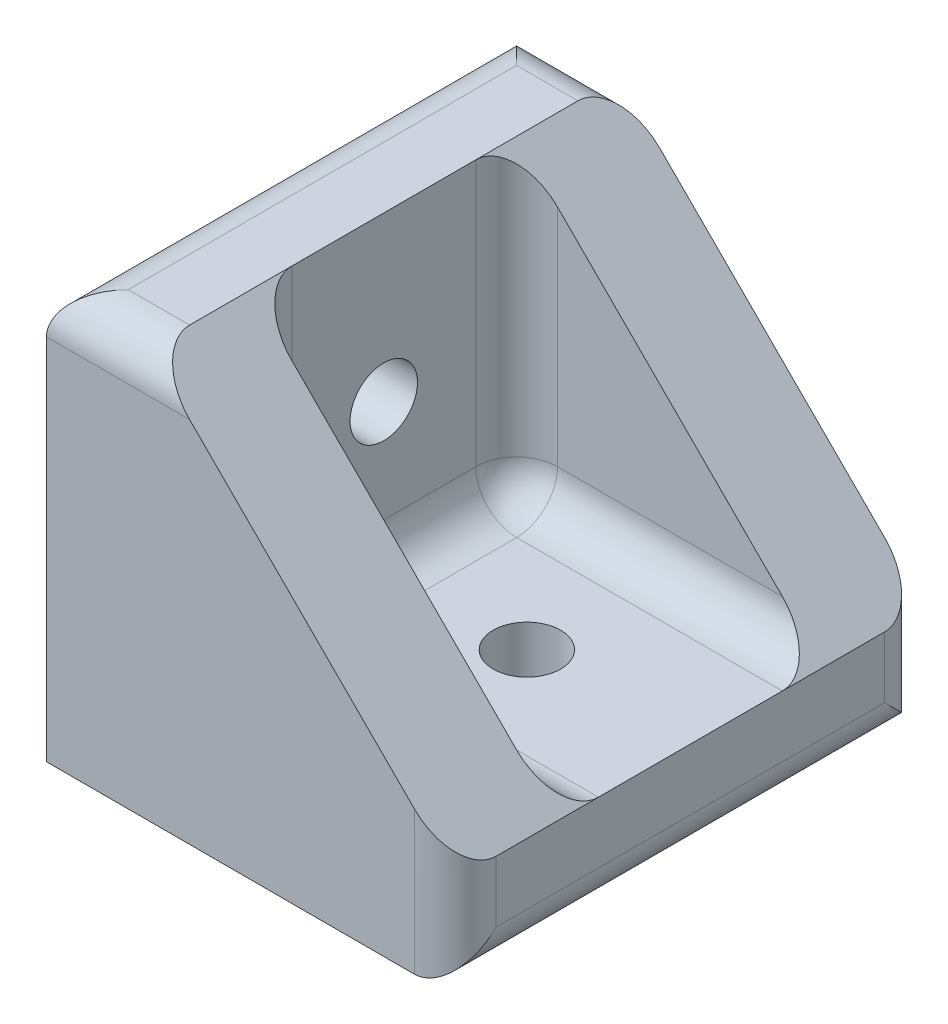
ISO-10303-21;
HEADER;
FILE_DESCRIPTION(('STEP AP214'),'2;1');
FILE_NAME('part.step','',(''),(''),'','','');
FILE_SCHEMA(('AUTOMOTIVE_DESIGN { 1 0 10303 214 1 1 1 1 }'));
ENDSEC;
DATA;
#1=APPLICATION_CONTEXT('core data for automotive mechanical design processes');
#2=APPLICATION_PROTOCOL_DEFINITION('international standard','automotive_design',2000,#1);
#3=PRODUCT_CONTEXT('',#1,'mechanical');
#4=PRODUCT('Part','Part','',(#3));
#5=PRODUCT_RELATED_PRODUCT_CATEGORY('part','',(#4));
#6=PRODUCT_DEFINITION_FORMATION('','',#4);
#7=PRODUCT_DEFINITION_CONTEXT('part definition',#1,'design');
#8=PRODUCT_DEFINITION('design','',#6,#7);
#9=PRODUCT_DEFINITION_SHAPE('','',#8);
#10=(LENGTH_UNIT() NAMED_UNIT(*) SI_UNIT(.MILLI.,.METRE.));
#11=(NAMED_UNIT(*) PLANE_ANGLE_UNIT() SI_UNIT($,.RADIAN.));
#12=(NAMED_UNIT(*) SI_UNIT($,.STERADIAN.) SOLID_ANGLE_UNIT());
#13=UNCERTAINTY_MEASURE_WITH_UNIT(LENGTH_MEASURE(1.E-05),#10,'distance_accuracy_value','');
#14=(GEOMETRIC_REPRESENTATION_CONTEXT(3) GLOBAL_UNCERTAINTY_ASSIGNED_CONTEXT((#13)) GLOBAL_UNIT_ASSIGNED_CONTEXT((#10,
#11,#12)) REPRESENTATION_CONTEXT('',''));
#15=CARTESIAN_POINT('',(0.,0.,0.));
#16=DIRECTION('',(0.,0.,1.));
#17=DIRECTION('',(1.,0.,0.));
#18=AXIS2_PLACEMENT_3D('',#15,#16,#17);
#19=CARTESIAN_POINT('',(5.,20.,-23.));
#20=DIRECTION('',(0.707106781186548,0.707106781186548,0.));
#21=DIRECTION('',(-0.707106781186548,0.707106781186548,0.));
#22=AXIS2_PLACEMENT_3D('',#19,#20,#21);
#23=PLANE('',#22);
#24=DIRECTION('',(-0.707106781186547,0.707106781186547,0.));
#25=VECTOR('',#24,1.);
#26=CARTESIAN_POINT('',(5.,20.,0.));
#27=LINE('',#26,#25);
#28=CARTESIAN_POINT('',(18.,7.,0.));
#29=VERTEX_POINT('',#28);
#30=CARTESIAN_POINT('',(7.,18.,0.));
#31=VERTEX_POINT('',#30);
#32=EDGE_CURVE('E184',#29,#31,#27,.T.);
#33=ORIENTED_EDGE('',*,*,#32,.F.);
#34=CARTESIAN_POINT('',(18.,7.,-2.));
#35=DIRECTION('',(0.707106781186548,0.707106781186548,0.));
#36=DIRECTION('',(0.707106781186548,-0.707106781186548,0.));
#37=AXIS2_PLACEMENT_3D('',#34,#35,#36);
#38=ELLIPSE('',#37,2.82842712474619,2.);
#39=CARTESIAN_POINT('',(20.,5.,-2.));
#40=VERTEX_POINT('',#39);
#41=EDGE_CURVE('E271',#29,#40,#38,.T.);
#42=ORIENTED_EDGE('',*,*,#41,.T.);
#43=DIRECTION('',(0.,0.,1.));
#44=VECTOR('',#43,1.);
#45=CARTESIAN_POINT('',(20.,5.,-23.));
#46=LINE('',#45,#44);
#47=CARTESIAN_POINT('',(20.,5.,-7.));
#48=VERTEX_POINT('',#47);
#49=EDGE_CURVE('E165',#48,#40,#46,.T.);
#50=ORIENTED_EDGE('',*,*,#49,.F.);
#51=CARTESIAN_POINT('',(18.,7.,-7.));
#52=DIRECTION('',(0.707106781186548,0.707106781186548,0.));
#53=DIRECTION('',(0.707106781186548,-0.707106781186548,0.));
#54=AXIS2_PLACEMENT_3D('',#51,#52,#53);
#55=ELLIPSE('',#54,2.82842712474619,2.);
#56=CARTESIAN_POINT('',(18.,7.,-5.));
#57=VERTEX_POINT('',#56);
#58=EDGE_CURVE('E226',#48,#57,#55,.F.);
#59=ORIENTED_EDGE('',*,*,#58,.T.);
#60=DIRECTION('',(-0.707106781186548,0.707106781186548,0.));
#61=VECTOR('',#60,1.);
#62=CARTESIAN_POINT('',(5.,20.,-5.));
#63=LINE('',#62,#61);
#64=CARTESIAN_POINT('',(7.,18.,-5.));
#65=VERTEX_POINT('',#64);
#66=EDGE_CURVE('E189',#57,#65,#63,.T.);
#67=ORIENTED_EDGE('',*,*,#66,.T.);
#68=CARTESIAN_POINT('',(7.,18.,-7.));
#69=DIRECTION('',(0.707106781186548,0.707106781186548,0.));
#70=DIRECTION('',(0.707106781186548,-0.707106781186548,0.));
#71=AXIS2_PLACEMENT_3D('',#68,#69,#70);
#72=ELLIPSE('',#71,2.82842712474619,2.);
#73=CARTESIAN_POINT('',(5.,20.,-7.));
#74=VERTEX_POINT('',#73);
#75=EDGE_CURVE('E224',#65,#74,#72,.F.);
#76=ORIENTED_EDGE('',*,*,#75,.T.);
#77=DIRECTION('',(0.,0.,1.));
#78=VECTOR('',#77,1.);
#79=CARTESIAN_POINT('',(5.,20.,-23.));
#80=LINE('',#79,#78);
#81=CARTESIAN_POINT('',(5.,20.,-2.));
#82=VERTEX_POINT('',#81);
#83=EDGE_CURVE('E192',#74,#82,#80,.T.);
#84=ORIENTED_EDGE('',*,*,#83,.T.);
#85=CARTESIAN_POINT('',(7.,18.,-2.));
#86=DIRECTION('',(0.707106781186548,0.707106781186548,0.));
#87=DIRECTION('',(0.707106781186548,-0.707106781186548,0.));
#88=AXIS2_PLACEMENT_3D('',#85,#86,#87);
#89=ELLIPSE('',#88,2.82842712474619,2.);
#90=EDGE_CURVE('E63',#82,#31,#89,.T.);
#91=ORIENTED_EDGE('',*,*,#90,.T.);
#92=EDGE_LOOP('',(#33,#42,#50,#59,#67,#76,#84,#91));
#93=FACE_BOUND('',#92,.T.);
#94=ADVANCED_FACE('F39',(#93),#23,.T.);
#95=CARTESIAN_POINT('',(20.,0.,-23.));
#96=DIRECTION('',(0.,-1.,0.));
#97=DIRECTION('',(0.,0.,-1.));
#98=AXIS2_PLACEMENT_3D('',#95,#96,#97);
#99=PLANE('',#98);
#100=CARTESIAN_POINT('',(12.,0.,-11.5));
#101=DIRECTION('',(0.,1.,0.));
#102=DIRECTION('',(0.,0.,1.));
#103=AXIS2_PLACEMENT_3D('',#100,#101,#102);
#104=CIRCLE('',#103,1.65);
#105=CARTESIAN_POINT('',(12.,0.,-9.85));
#106=VERTEX_POINT('',#105);
#107=EDGE_CURVE('E281',#106,#106,#104,.T.);
#108=ORIENTED_EDGE('',*,*,#107,.T.);
#109=EDGE_LOOP('',(#108));
#110=FACE_BOUND('',#109,.T.);
#111=DIRECTION('',(1.,0.,0.));
#112=VECTOR('',#111,1.);
#113=CARTESIAN_POINT('',(20.,0.,-23.));
#114=LINE('',#113,#112);
#115=CARTESIAN_POINT('',(0.,0.,-23.));
#116=VERTEX_POINT('',#115);
#117=CARTESIAN_POINT('',(18.,0.,-23.));
#118=VERTEX_POINT('',#117);
#119=EDGE_CURVE('E167',#116,#118,#114,.T.);
#120=ORIENTED_EDGE('',*,*,#119,.T.);
#121=DIRECTION('',(0.,0.,1.));
#122=VECTOR('',#121,1.);
#123=CARTESIAN_POINT('',(18.,0.,-23.));
#124=LINE('',#123,#122);
#125=CARTESIAN_POINT('',(18.,0.,0.));
#126=VERTEX_POINT('',#125);
#127=EDGE_CURVE('E48',#118,#126,#124,.T.);
#128=ORIENTED_EDGE('',*,*,#127,.T.);
#129=DIRECTION('',(1.,0.,0.));
#130=VECTOR('',#129,1.);
#131=CARTESIAN_POINT('',(20.,0.,0.));
#132=LINE('',#131,#130);
#133=CARTESIAN_POINT('',(0.,0.,0.));
#134=VERTEX_POINT('',#133);
#135=EDGE_CURVE('E173',#134,#126,#132,.T.);
#136=ORIENTED_EDGE('',*,*,#135,.F.);
#137=DIRECTION('',(0.,0.,1.));
#138=VECTOR('',#137,1.);
#139=CARTESIAN_POINT('',(0.,0.,-23.));
#140=LINE('',#139,#138);
#141=EDGE_CURVE('E156',#116,#134,#140,.T.);
#142=ORIENTED_EDGE('',*,*,#141,.F.);
#143=EDGE_LOOP('',(#120,#128,#136,#142));
#144=FACE_BOUND('',#143,.T.);
#145=ADVANCED_FACE('F169',(#110,#144),#99,.T.);
#146=CARTESIAN_POINT('',(0.,0.,-23.));
#147=DIRECTION('',(-1.,0.,0.));
#148=DIRECTION('',(0.,0.,1.));
#149=AXIS2_PLACEMENT_3D('',#146,#147,#148);
#150=PLANE('',#149);
#151=CARTESIAN_POINT('',(0.,12.,-11.5));
#152=DIRECTION('',(1.,0.,0.));
#153=DIRECTION('',(0.,0.,-1.));
#154=AXIS2_PLACEMENT_3D('',#151,#152,#153);
#155=CIRCLE('',#154,1.65);
#156=CARTESIAN_POINT('',(0.,12.,-13.15));
#157=VERTEX_POINT('',#156);
#158=EDGE_CURVE('E292',#157,#157,#155,.T.);
#159=ORIENTED_EDGE('',*,*,#158,.T.);
#160=EDGE_LOOP('',(#159));
#161=FACE_BOUND('',#160,.T.);
#162=DIRECTION('',(0.,-1.,0.));
#163=VECTOR('',#162,1.);
#164=CARTESIAN_POINT('',(0.,0.,0.));
#165=LINE('',#164,#163);
#166=CARTESIAN_POINT('',(0.,18.,0.));
#167=VERTEX_POINT('',#166);
#168=EDGE_CURVE('E181',#167,#134,#165,.T.);
#169=ORIENTED_EDGE('',*,*,#168,.F.);
#170=DIRECTION('',(0.,0.,1.));
#171=VECTOR('',#170,1.);
#172=CARTESIAN_POINT('',(0.,18.,-23.));
#173=LINE('',#172,#171);
#174=CARTESIAN_POINT('',(0.,18.,-23.));
#175=VERTEX_POINT('',#174);
#176=EDGE_CURVE('E11',#167,#175,#173,.F.);
#177=ORIENTED_EDGE('',*,*,#176,.T.);
#178=DIRECTION('',(0.,-1.,0.));
#179=VECTOR('',#178,1.);
#180=CARTESIAN_POINT('',(0.,0.,-23.));
#181=LINE('',#180,#179);
#182=EDGE_CURVE('E154',#175,#116,#181,.T.);
#183=ORIENTED_EDGE('',*,*,#182,.T.);
#184=ORIENTED_EDGE('',*,*,#141,.T.);
#185=EDGE_LOOP('',(#169,#177,#183,#184));
#186=FACE_BOUND('',#185,.T.);
#187=ADVANCED_FACE('F160',(#161,#186),#150,.T.);
#188=CARTESIAN_POINT('',(0.,20.,-23.));
#189=DIRECTION('',(0.,1.,0.));
#190=DIRECTION('',(0.,0.,1.));
#191=AXIS2_PLACEMENT_3D('',#188,#189,#190);
#192=PLANE('',#191);
#193=CARTESIAN_POINT('',(5.,20.,-21.));
#194=VERTEX_POINT('',#193);
#195=CARTESIAN_POINT('',(5.,20.,-16.));
#196=VERTEX_POINT('',#195);
#197=EDGE_CURVE('E174',#194,#196,#80,.T.);
#198=ORIENTED_EDGE('',*,*,#197,.F.);
#199=DIRECTION('',(-1.,0.,0.));
#200=VECTOR('',#199,1.);
#201=CARTESIAN_POINT('',(0.,20.,-21.));
#202=LINE('',#201,#200);
#203=CARTESIAN_POINT('',(2.,20.,-21.));
#204=VERTEX_POINT('',#203);
#205=EDGE_CURVE('E255',#194,#204,#202,.T.);
#206=ORIENTED_EDGE('',*,*,#205,.T.);
#207=DIRECTION('',(0.,0.,1.));
#208=VECTOR('',#207,1.);
#209=CARTESIAN_POINT('',(2.,20.,-23.));
#210=LINE('',#209,#208);
#211=CARTESIAN_POINT('',(2.,20.,-2.));
#212=VERTEX_POINT('',#211);
#213=EDGE_CURVE('E229',#204,#212,#210,.T.);
#214=ORIENTED_EDGE('',*,*,#213,.T.);
#215=DIRECTION('',(-1.,0.,0.));
#216=VECTOR('',#215,1.);
#217=CARTESIAN_POINT('',(5.,20.,-2.));
#218=LINE('',#217,#216);
#219=EDGE_CURVE('E249',#212,#82,#218,.F.);
#220=ORIENTED_EDGE('',*,*,#219,.T.);
#221=ORIENTED_EDGE('',*,*,#83,.F.);
#222=DIRECTION('',(0.,0.,1.));
#223=VECTOR('',#222,1.);
#224=CARTESIAN_POINT('',(5.,20.,-23.));
#225=LINE('',#224,#223);
#226=EDGE_CURVE('E191',#196,#74,#225,.T.);
#227=ORIENTED_EDGE('',*,*,#226,.F.);
#228=EDGE_LOOP('',(#198,#206,#214,#220,#221,#227));
#229=FACE_BOUND('',#228,.T.);
#230=ADVANCED_FACE('F330',(#229),#192,.T.);
#231=DIRECTION('',(-0.707106781186547,0.707106781186547,0.));
#232=VECTOR('',#231,1.);
#233=CARTESIAN_POINT('',(5.,20.,-23.));
#234=LINE('',#233,#232);
#235=CARTESIAN_POINT('',(18.,7.,-23.));
#236=VERTEX_POINT('',#235);
#237=CARTESIAN_POINT('',(7.,18.,-23.));
#238=VERTEX_POINT('',#237);
#239=EDGE_CURVE('E164',#236,#238,#234,.T.);
#240=ORIENTED_EDGE('',*,*,#239,.T.);
#241=CARTESIAN_POINT('',(7.,18.,-21.));
#242=DIRECTION('',(0.707106781186548,0.707106781186548,0.));
#243=DIRECTION('',(-0.707106781186548,0.707106781186548,0.));
#244=AXIS2_PLACEMENT_3D('',#241,#242,#243);
#245=ELLIPSE('',#244,2.82842712474619,2.);
#246=EDGE_CURVE('E257',#238,#194,#245,.T.);
#247=ORIENTED_EDGE('',*,*,#246,.T.);
#248=ORIENTED_EDGE('',*,*,#197,.T.);
#249=CARTESIAN_POINT('',(7.,18.,-16.));
#250=DIRECTION('',(0.707106781186548,0.707106781186548,0.));
#251=DIRECTION('',(-0.707106781186548,0.707106781186548,0.));
#252=AXIS2_PLACEMENT_3D('',#249,#250,#251);
#253=ELLIPSE('',#252,2.82842712474619,2.);
#254=CARTESIAN_POINT('',(7.,18.,-18.));
#255=VERTEX_POINT('',#254);
#256=EDGE_CURVE('E219',#196,#255,#253,.F.);
#257=ORIENTED_EDGE('',*,*,#256,.T.);
#258=DIRECTION('',(-0.707106781186548,0.707106781186548,0.));
#259=VECTOR('',#258,1.);
#260=CARTESIAN_POINT('',(5.,20.,-18.));
#261=LINE('',#260,#259);
#262=CARTESIAN_POINT('',(18.,7.,-18.));
#263=VERTEX_POINT('',#262);
#264=EDGE_CURVE('E297',#263,#255,#261,.T.);
#265=ORIENTED_EDGE('',*,*,#264,.F.);
#266=CARTESIAN_POINT('',(18.,7.,-16.));
#267=DIRECTION('',(0.707106781186548,0.707106781186548,0.));
#268=DIRECTION('',(-0.707106781186548,0.707106781186548,0.));
#269=AXIS2_PLACEMENT_3D('',#266,#267,#268);
#270=ELLIPSE('',#269,2.82842712474619,2.);
#271=CARTESIAN_POINT('',(20.,5.,-16.));
#272=VERTEX_POINT('',#271);
#273=EDGE_CURVE('E225',#263,#272,#270,.F.);
#274=ORIENTED_EDGE('',*,*,#273,.T.);
#275=CARTESIAN_POINT('',(20.,5.,-21.));
#276=VERTEX_POINT('',#275);
#277=EDGE_CURVE('E196',#276,#272,#46,.T.);
#278=ORIENTED_EDGE('',*,*,#277,.F.);
#279=CARTESIAN_POINT('',(18.,7.,-21.));
#280=DIRECTION('',(0.707106781186548,0.707106781186548,0.));
#281=DIRECTION('',(-0.707106781186548,0.707106781186548,0.));
#282=AXIS2_PLACEMENT_3D('',#279,#280,#281);
#283=ELLIPSE('',#282,2.82842712474619,2.);
#284=EDGE_CURVE('E260',#276,#236,#283,.T.);
#285=ORIENTED_EDGE('',*,*,#284,.T.);
#286=EDGE_LOOP('',(#240,#247,#248,#257,#265,#274,#278,#285));
#287=FACE_BOUND('',#286,.T.);
#288=ADVANCED_FACE('F331',(#287),#23,.T.);
#289=CARTESIAN_POINT('',(20.,5.,-23.));
#290=DIRECTION('',(1.,0.,0.));
#291=DIRECTION('',(0.,0.,-1.));
#292=AXIS2_PLACEMENT_3D('',#289,#290,#291);
#293=PLANE('',#292);
#294=DIRECTION('',(0.,0.,1.));
#295=VECTOR('',#294,1.);
#296=CARTESIAN_POINT('',(20.,2.,-23.));
#297=LINE('',#296,#295);
#298=CARTESIAN_POINT('',(20.,2.,-2.));
#299=VERTEX_POINT('',#298);
#300=CARTESIAN_POINT('',(20.,2.,-21.));
#301=VERTEX_POINT('',#300);
#302=EDGE_CURVE('E265',#299,#301,#297,.F.);
#303=ORIENTED_EDGE('',*,*,#302,.T.);
#304=DIRECTION('',(0.,1.,0.));
#305=VECTOR('',#304,1.);
#306=CARTESIAN_POINT('',(20.,5.,-21.));
#307=LINE('',#306,#305);
#308=EDGE_CURVE('E268',#301,#276,#307,.T.);
#309=ORIENTED_EDGE('',*,*,#308,.T.);
#310=ORIENTED_EDGE('',*,*,#277,.T.);
#311=DIRECTION('',(0.,0.,1.));
#312=VECTOR('',#311,1.);
#313=CARTESIAN_POINT('',(20.,5.,-23.));
#314=LINE('',#313,#312);
#315=EDGE_CURVE('E296',#272,#48,#314,.T.);
#316=ORIENTED_EDGE('',*,*,#315,.T.);
#317=ORIENTED_EDGE('',*,*,#49,.T.);
#318=DIRECTION('',(0.,1.,0.));
#319=VECTOR('',#318,1.);
#320=CARTESIAN_POINT('',(20.,0.,-2.));
#321=LINE('',#320,#319);
#322=EDGE_CURVE('E263',#40,#299,#321,.F.);
#323=ORIENTED_EDGE('',*,*,#322,.T.);
#324=EDGE_LOOP('',(#303,#309,#310,#316,#317,#323));
#325=FACE_BOUND('',#324,.T.);
#326=ADVANCED_FACE('F362',(#325),#293,.T.);
#327=CARTESIAN_POINT('',(0.,0.,-23.));
#328=DIRECTION('',(0.,0.,-1.));
#329=DIRECTION('',(-1.,0.,0.));
#330=AXIS2_PLACEMENT_3D('',#327,#328,#329);
#331=PLANE('',#330);
#332=ORIENTED_EDGE('',*,*,#182,.F.);
#333=DIRECTION('',(-1.,0.,0.));
#334=VECTOR('',#333,1.);
#335=CARTESIAN_POINT('',(0.,18.,-23.));
#336=LINE('',#335,#334);
#337=EDGE_CURVE('E259',#175,#238,#336,.F.);
#338=ORIENTED_EDGE('',*,*,#337,.T.);
#339=ORIENTED_EDGE('',*,*,#239,.F.);
#340=DIRECTION('',(0.,1.,0.));
#341=VECTOR('',#340,1.);
#342=CARTESIAN_POINT('',(18.,0.,-23.));
#343=LINE('',#342,#341);
#344=EDGE_CURVE('E179',#236,#118,#343,.F.);
#345=ORIENTED_EDGE('',*,*,#344,.T.);
#346=ORIENTED_EDGE('',*,*,#119,.F.);
#347=EDGE_LOOP('',(#332,#338,#339,#345,#346));
#348=FACE_BOUND('',#347,.T.);
#349=ADVANCED_FACE('F180',(#348),#331,.T.);
#350=CARTESIAN_POINT('',(0.,0.,0.));
#351=DIRECTION('',(0.,0.,-1.));
#352=DIRECTION('',(-1.,0.,0.));
#353=AXIS2_PLACEMENT_3D('',#350,#351,#352);
#354=PLANE('',#353);
#355=ORIENTED_EDGE('',*,*,#135,.T.);
#356=DIRECTION('',(0.,1.,0.));
#357=VECTOR('',#356,1.);
#358=CARTESIAN_POINT('',(18.,5.,0.));
#359=LINE('',#358,#357);
#360=EDGE_CURVE('E269',#126,#29,#359,.T.);
#361=ORIENTED_EDGE('',*,*,#360,.T.);
#362=ORIENTED_EDGE('',*,*,#32,.T.);
#363=DIRECTION('',(-1.,0.,0.));
#364=VECTOR('',#363,1.);
#365=CARTESIAN_POINT('',(0.,18.,0.));
#366=LINE('',#365,#364);
#367=EDGE_CURVE('E57',#31,#167,#366,.T.);
#368=ORIENTED_EDGE('',*,*,#367,.T.);
#369=ORIENTED_EDGE('',*,*,#168,.T.);
#370=EDGE_LOOP('',(#355,#361,#362,#368,#369));
#371=FACE_BOUND('',#370,.T.);
#372=ADVANCED_FACE('F376',(#371),#354,.F.);
#373=CARTESIAN_POINT('',(20.,5.,-23.));
#374=DIRECTION('',(0.,-1.,0.));
#375=DIRECTION('',(0.,0.,-1.));
#376=AXIS2_PLACEMENT_3D('',#373,#374,#375);
#377=PLANE('',#376);
#378=CARTESIAN_POINT('',(12.,5.,-11.5));
#379=DIRECTION('',(0.,1.,0.));
#380=DIRECTION('',(0.,0.,1.));
#381=AXIS2_PLACEMENT_3D('',#378,#379,#380);
#382=CIRCLE('',#381,1.65);
#383=CARTESIAN_POINT('',(12.,5.,-9.85));
#384=VERTEX_POINT('',#383);
#385=EDGE_CURVE('E290',#384,#384,#382,.T.);
#386=ORIENTED_EDGE('',*,*,#385,.F.);
#387=EDGE_LOOP('',(#386));
#388=FACE_BOUND('',#387,.T.);
#389=ORIENTED_EDGE('',*,*,#315,.F.);
#390=DIRECTION('',(1.,0.,0.));
#391=VECTOR('',#390,1.);
#392=CARTESIAN_POINT('',(5.,5.,-16.));
#393=LINE('',#392,#391);
#394=CARTESIAN_POINT('',(7.,5.,-16.));
#395=VERTEX_POINT('',#394);
#396=EDGE_CURVE('E213',#272,#395,#393,.F.);
#397=ORIENTED_EDGE('',*,*,#396,.T.);
#398=DIRECTION('',(0.,0.,1.));
#399=VECTOR('',#398,1.);
#400=CARTESIAN_POINT('',(7.,5.,-5.));
#401=LINE('',#400,#399);
#402=CARTESIAN_POINT('',(7.,5.,-7.));
#403=VERTEX_POINT('',#402);
#404=EDGE_CURVE('E209',#395,#403,#401,.T.);
#405=ORIENTED_EDGE('',*,*,#404,.T.);
#406=DIRECTION('',(1.,0.,0.));
#407=VECTOR('',#406,1.);
#408=CARTESIAN_POINT('',(20.,5.,-7.));
#409=LINE('',#408,#407);
#410=EDGE_CURVE('E214',#403,#48,#409,.T.);
#411=ORIENTED_EDGE('',*,*,#410,.T.);
#412=EDGE_LOOP('',(#389,#397,#405,#411));
#413=FACE_BOUND('',#412,.T.);
#414=ADVANCED_FACE('F378',(#388,#413),#377,.F.);
#415=CARTESIAN_POINT('',(5.,0.,-23.));
#416=DIRECTION('',(-1.,0.,0.));
#417=DIRECTION('',(0.,0.,1.));
#418=AXIS2_PLACEMENT_3D('',#415,#416,#417);
#419=PLANE('',#418);
#420=CARTESIAN_POINT('',(5.,12.,-11.5));
#421=DIRECTION('',(1.,0.,0.));
#422=DIRECTION('',(0.,0.,-1.));
#423=AXIS2_PLACEMENT_3D('',#420,#421,#422);
#424=CIRCLE('',#423,1.65);
#425=CARTESIAN_POINT('',(5.,12.,-13.15));
#426=VERTEX_POINT('',#425);
#427=EDGE_CURVE('E407',#426,#426,#424,.T.);
#428=ORIENTED_EDGE('',*,*,#427,.F.);
#429=EDGE_LOOP('',(#428));
#430=FACE_BOUND('',#429,.T.);
#431=DIRECTION('',(0.,0.,1.));
#432=VECTOR('',#431,1.);
#433=CARTESIAN_POINT('',(5.,7.,-18.));
#434=LINE('',#433,#432);
#435=CARTESIAN_POINT('',(5.,7.,-7.));
#436=VERTEX_POINT('',#435);
#437=CARTESIAN_POINT('',(5.,7.,-16.));
#438=VERTEX_POINT('',#437);
#439=EDGE_CURVE('E205',#436,#438,#434,.F.);
#440=ORIENTED_EDGE('',*,*,#439,.T.);
#441=DIRECTION('',(0.,-1.,0.));
#442=VECTOR('',#441,1.);
#443=CARTESIAN_POINT('',(5.,20.,-16.));
#444=LINE('',#443,#442);
#445=EDGE_CURVE('E207',#438,#196,#444,.F.);
#446=ORIENTED_EDGE('',*,*,#445,.T.);
#447=ORIENTED_EDGE('',*,*,#226,.T.);
#448=DIRECTION('',(0.,-1.,0.));
#449=VECTOR('',#448,1.);
#450=CARTESIAN_POINT('',(5.,0.,-7.));
#451=LINE('',#450,#449);
#452=EDGE_CURVE('E202',#74,#436,#451,.T.);
#453=ORIENTED_EDGE('',*,*,#452,.T.);
#454=EDGE_LOOP('',(#440,#446,#447,#453));
#455=FACE_BOUND('',#454,.T.);
#456=ADVANCED_FACE('F316',(#430,#455),#419,.F.);
#457=CARTESIAN_POINT('',(0.,0.,-18.));
#458=DIRECTION('',(0.,0.,-1.));
#459=DIRECTION('',(-1.,0.,0.));
#460=AXIS2_PLACEMENT_3D('',#457,#458,#459);
#461=PLANE('',#460);
#462=ORIENTED_EDGE('',*,*,#264,.T.);
#463=DIRECTION('',(0.,-1.,0.));
#464=VECTOR('',#463,1.);
#465=CARTESIAN_POINT('',(7.,5.,-18.));
#466=LINE('',#465,#464);
#467=CARTESIAN_POINT('',(7.,7.,-18.));
#468=VERTEX_POINT('',#467);
#469=EDGE_CURVE('E198',#255,#468,#466,.T.);
#470=ORIENTED_EDGE('',*,*,#469,.T.);
#471=DIRECTION('',(1.,0.,0.));
#472=VECTOR('',#471,1.);
#473=CARTESIAN_POINT('',(20.,7.,-18.));
#474=LINE('',#473,#472);
#475=EDGE_CURVE('E172',#468,#263,#474,.T.);
#476=ORIENTED_EDGE('',*,*,#475,.T.);
#477=EDGE_LOOP('',(#462,#470,#476));
#478=FACE_BOUND('',#477,.T.);
#479=ADVANCED_FACE('F389',(#478),#461,.F.);
#480=CARTESIAN_POINT('',(0.,0.,-5.));
#481=DIRECTION('',(0.,0.,-1.));
#482=DIRECTION('',(-1.,0.,0.));
#483=AXIS2_PLACEMENT_3D('',#480,#481,#482);
#484=PLANE('',#483);
#485=DIRECTION('',(1.,0.,0.));
#486=VECTOR('',#485,1.);
#487=CARTESIAN_POINT('',(0.,7.,-5.));
#488=LINE('',#487,#486);
#489=CARTESIAN_POINT('',(7.,7.,-5.));
#490=VERTEX_POINT('',#489);
#491=EDGE_CURVE('E216',#57,#490,#488,.F.);
#492=ORIENTED_EDGE('',*,*,#491,.T.);
#493=DIRECTION('',(0.,-1.,0.));
#494=VECTOR('',#493,1.);
#495=CARTESIAN_POINT('',(7.,0.,-5.));
#496=LINE('',#495,#494);
#497=EDGE_CURVE('E217',#490,#65,#496,.F.);
#498=ORIENTED_EDGE('',*,*,#497,.T.);
#499=ORIENTED_EDGE('',*,*,#66,.F.);
#500=EDGE_LOOP('',(#492,#498,#499));
#501=FACE_BOUND('',#500,.T.);
#502=ADVANCED_FACE('F385',(#501),#484,.T.);
#503=CARTESIAN_POINT('',(20.,7.,-7.));
#504=DIRECTION('',(1.,0.,0.));
#505=DIRECTION('',(0.,0.,-1.));
#506=AXIS2_PLACEMENT_3D('',#503,#504,#505);
#507=CYLINDRICAL_SURFACE('',#506,2.);
#508=ORIENTED_EDGE('',*,*,#58,.F.);
#509=ORIENTED_EDGE('',*,*,#410,.F.);
#510=CARTESIAN_POINT('',(7.,7.,-7.));
#511=DIRECTION('',(1.,0.,0.));
#512=DIRECTION('',(0.,1.,0.));
#513=AXIS2_PLACEMENT_3D('',#510,#511,#512);
#514=CIRCLE('',#513,2.);
#515=EDGE_CURVE('E246',#490,#403,#514,.T.);
#516=ORIENTED_EDGE('',*,*,#515,.F.);
#517=ORIENTED_EDGE('',*,*,#491,.F.);
#518=EDGE_LOOP('',(#508,#509,#516,#517));
#519=FACE_BOUND('',#518,.T.);
#520=ADVANCED_FACE('F383',(#519),#507,.F.);
#521=CARTESIAN_POINT('',(7.,0.,-7.));
#522=DIRECTION('',(0.,-1.,0.));
#523=DIRECTION('',(0.,0.,-1.));
#524=AXIS2_PLACEMENT_3D('',#521,#522,#523);
#525=CYLINDRICAL_SURFACE('',#524,2.);
#526=ORIENTED_EDGE('',*,*,#75,.F.);
#527=ORIENTED_EDGE('',*,*,#497,.F.);
#528=CARTESIAN_POINT('',(7.,7.,-7.));
#529=DIRECTION('',(0.,1.,0.));
#530=DIRECTION('',(0.,0.,1.));
#531=AXIS2_PLACEMENT_3D('',#528,#529,#530);
#532=CIRCLE('',#531,2.);
#533=EDGE_CURVE('E243',#436,#490,#532,.T.);
#534=ORIENTED_EDGE('',*,*,#533,.F.);
#535=ORIENTED_EDGE('',*,*,#452,.F.);
#536=EDGE_LOOP('',(#526,#527,#534,#535));
#537=FACE_BOUND('',#536,.T.);
#538=ADVANCED_FACE('F313',(#537),#525,.F.);
#539=CARTESIAN_POINT('',(7.,7.,-7.));
#540=DIRECTION('',(0.,0.,1.));
#541=DIRECTION('',(1.,0.,0.));
#542=AXIS2_PLACEMENT_3D('',#539,#540,#541);
#543=SPHERICAL_SURFACE('',#542,2.);
#544=ORIENTED_EDGE('',*,*,#533,.T.);
#545=ORIENTED_EDGE('',*,*,#515,.T.);
#546=CARTESIAN_POINT('',(7.,7.,-7.));
#547=DIRECTION('',(0.,0.,-1.));
#548=DIRECTION('',(-1.,0.,0.));
#549=AXIS2_PLACEMENT_3D('',#546,#547,#548);
#550=CIRCLE('',#549,2.);
#551=EDGE_CURVE('E239',#436,#403,#550,.F.);
#552=ORIENTED_EDGE('',*,*,#551,.F.);
#553=EDGE_LOOP('',(#544,#545,#552));
#554=FACE_BOUND('',#553,.T.);
#555=ADVANCED_FACE('F514',(#554),#543,.F.);
#556=CARTESIAN_POINT('',(0.,7.,-16.));
#557=DIRECTION('',(-1.,0.,0.));
#558=DIRECTION('',(0.,0.,1.));
#559=AXIS2_PLACEMENT_3D('',#556,#557,#558);
#560=CYLINDRICAL_SURFACE('',#559,2.);
#561=ORIENTED_EDGE('',*,*,#273,.F.);
#562=ORIENTED_EDGE('',*,*,#475,.F.);
#563=CARTESIAN_POINT('',(7.,7.,-16.));
#564=DIRECTION('',(1.,0.,0.));
#565=DIRECTION('',(0.,0.,-1.));
#566=AXIS2_PLACEMENT_3D('',#563,#564,#565);
#567=CIRCLE('',#566,2.);
#568=EDGE_CURVE('E240',#395,#468,#567,.T.);
#569=ORIENTED_EDGE('',*,*,#568,.F.);
#570=ORIENTED_EDGE('',*,*,#396,.F.);
#571=EDGE_LOOP('',(#561,#562,#569,#570));
#572=FACE_BOUND('',#571,.T.);
#573=ADVANCED_FACE('F503',(#572),#560,.F.);
#574=CARTESIAN_POINT('',(7.,7.,-23.));
#575=DIRECTION('',(0.,0.,-1.));
#576=DIRECTION('',(-1.,0.,0.));
#577=AXIS2_PLACEMENT_3D('',#574,#575,#576);
#578=CYLINDRICAL_SURFACE('',#577,2.);
#579=ORIENTED_EDGE('',*,*,#551,.T.);
#580=ORIENTED_EDGE('',*,*,#404,.F.);
#581=CARTESIAN_POINT('',(7.,7.,-16.));
#582=DIRECTION('',(0.,0.,1.));
#583=DIRECTION('',(1.,0.,0.));
#584=AXIS2_PLACEMENT_3D('',#581,#582,#583);
#585=CIRCLE('',#584,2.);
#586=EDGE_CURVE('E231',#438,#395,#585,.T.);
#587=ORIENTED_EDGE('',*,*,#586,.F.);
#588=ORIENTED_EDGE('',*,*,#439,.F.);
#589=EDGE_LOOP('',(#579,#580,#587,#588));
#590=FACE_BOUND('',#589,.T.);
#591=ADVANCED_FACE('F491',(#590),#578,.F.);
#592=CARTESIAN_POINT('',(7.,7.,-16.));
#593=DIRECTION('',(0.,-1.,0.));
#594=DIRECTION('',(1.,0.,0.));
#595=AXIS2_PLACEMENT_3D('',#592,#593,#594);
#596=SPHERICAL_SURFACE('',#595,2.);
#597=ORIENTED_EDGE('',*,*,#586,.T.);
#598=ORIENTED_EDGE('',*,*,#568,.T.);
#599=CARTESIAN_POINT('',(7.,7.,-16.));
#600=DIRECTION('',(0.,1.,0.));
#601=DIRECTION('',(0.,0.,1.));
#602=AXIS2_PLACEMENT_3D('',#599,#600,#601);
#603=CIRCLE('',#602,2.);
#604=EDGE_CURVE('E233',#438,#468,#603,.F.);
#605=ORIENTED_EDGE('',*,*,#604,.F.);
#606=EDGE_LOOP('',(#597,#598,#605));
#607=FACE_BOUND('',#606,.T.);
#608=ADVANCED_FACE('F482',(#607),#596,.F.);
#609=CARTESIAN_POINT('',(7.,0.,-16.));
#610=DIRECTION('',(0.,1.,0.));
#611=DIRECTION('',(0.,0.,1.));
#612=AXIS2_PLACEMENT_3D('',#609,#610,#611);
#613=CYLINDRICAL_SURFACE('',#612,2.);
#614=ORIENTED_EDGE('',*,*,#256,.F.);
#615=ORIENTED_EDGE('',*,*,#445,.F.);
#616=ORIENTED_EDGE('',*,*,#604,.T.);
#617=ORIENTED_EDGE('',*,*,#469,.F.);
#618=EDGE_LOOP('',(#614,#615,#616,#617));
#619=FACE_BOUND('',#618,.T.);
#620=ADVANCED_FACE('F329',(#619),#613,.F.);
#621=CARTESIAN_POINT('',(0.,18.,-2.));
#622=DIRECTION('',(1.,0.,0.));
#623=DIRECTION('',(0.,0.,-1.));
#624=AXIS2_PLACEMENT_3D('',#621,#622,#623);
#625=CYLINDRICAL_SURFACE('',#624,2.);
#626=ORIENTED_EDGE('',*,*,#90,.F.);
#627=ORIENTED_EDGE('',*,*,#219,.F.);
#628=CARTESIAN_POINT('',(2.,18.,-2.));
#629=DIRECTION('',(0.707106781186547,0.,0.707106781186547));
#630=DIRECTION('',(-0.707106781186547,0.,0.707106781186547));
#631=AXIS2_PLACEMENT_3D('',#628,#629,#630);
#632=ELLIPSE('',#631,2.82842712474619,2.);
#633=EDGE_CURVE('E234',#167,#212,#632,.F.);
#634=ORIENTED_EDGE('',*,*,#633,.F.);
#635=ORIENTED_EDGE('',*,*,#367,.F.);
#636=EDGE_LOOP('',(#626,#627,#634,#635));
#637=FACE_BOUND('',#636,.T.);
#638=ADVANCED_FACE('F343',(#637),#625,.T.);
#639=CARTESIAN_POINT('',(2.,18.,-23.));
#640=DIRECTION('',(0.,0.,1.));
#641=DIRECTION('',(1.,0.,0.));
#642=AXIS2_PLACEMENT_3D('',#639,#640,#641);
#643=CYLINDRICAL_SURFACE('',#642,2.);
#644=ORIENTED_EDGE('',*,*,#633,.T.);
#645=ORIENTED_EDGE('',*,*,#213,.F.);
#646=CARTESIAN_POINT('',(2.,18.,-21.));
#647=DIRECTION('',(-0.707106781186547,0.,0.707106781186547));
#648=DIRECTION('',(0.707106781186547,0.,0.707106781186547));
#649=AXIS2_PLACEMENT_3D('',#646,#647,#648);
#650=ELLIPSE('',#649,2.82842712474619,2.);
#651=EDGE_CURVE('E279',#175,#204,#650,.F.);
#652=ORIENTED_EDGE('',*,*,#651,.F.);
#653=ORIENTED_EDGE('',*,*,#176,.F.);
#654=EDGE_LOOP('',(#644,#645,#652,#653));
#655=FACE_BOUND('',#654,.T.);
#656=ADVANCED_FACE('F342',(#655),#643,.T.);
#657=CARTESIAN_POINT('',(0.,18.,-21.));
#658=DIRECTION('',(-1.,0.,0.));
#659=DIRECTION('',(0.,0.,1.));
#660=AXIS2_PLACEMENT_3D('',#657,#658,#659);
#661=CYLINDRICAL_SURFACE('',#660,2.);
#662=ORIENTED_EDGE('',*,*,#246,.F.);
#663=ORIENTED_EDGE('',*,*,#337,.F.);
#664=ORIENTED_EDGE('',*,*,#651,.T.);
#665=ORIENTED_EDGE('',*,*,#205,.F.);
#666=EDGE_LOOP('',(#662,#663,#664,#665));
#667=FACE_BOUND('',#666,.T.);
#668=ADVANCED_FACE('F340',(#667),#661,.T.);
#669=CARTESIAN_POINT('',(18.,0.,-2.));
#670=DIRECTION('',(0.,-1.,0.));
#671=DIRECTION('',(0.,0.,-1.));
#672=AXIS2_PLACEMENT_3D('',#669,#670,#671);
#673=CYLINDRICAL_SURFACE('',#672,2.);
#674=ORIENTED_EDGE('',*,*,#41,.F.);
#675=ORIENTED_EDGE('',*,*,#360,.F.);
#676=CARTESIAN_POINT('',(18.,2.,-2.));
#677=DIRECTION('',(0.,0.707106781186547,0.707106781186547));
#678=DIRECTION('',(0.,-0.707106781186547,0.707106781186547));
#679=AXIS2_PLACEMENT_3D('',#676,#677,#678);
#680=ELLIPSE('',#679,2.82842712474619,2.);
#681=EDGE_CURVE('E43',#299,#126,#680,.F.);
#682=ORIENTED_EDGE('',*,*,#681,.F.);
#683=ORIENTED_EDGE('',*,*,#322,.F.);
#684=EDGE_LOOP('',(#674,#675,#682,#683));
#685=FACE_BOUND('',#684,.T.);
#686=ADVANCED_FACE('F41',(#685),#673,.T.);
#687=CARTESIAN_POINT('',(18.,2.,-23.));
#688=DIRECTION('',(0.,0.,1.));
#689=DIRECTION('',(1.,0.,0.));
#690=AXIS2_PLACEMENT_3D('',#687,#688,#689);
#691=CYLINDRICAL_SURFACE('',#690,2.);
#692=ORIENTED_EDGE('',*,*,#681,.T.);
#693=ORIENTED_EDGE('',*,*,#127,.F.);
#694=CARTESIAN_POINT('',(18.,2.,-21.));
#695=DIRECTION('',(0.,-0.707106781186547,0.707106781186547));
#696=DIRECTION('',(0.,0.707106781186547,0.707106781186547));
#697=AXIS2_PLACEMENT_3D('',#694,#695,#696);
#698=ELLIPSE('',#697,2.82842712474619,2.);
#699=EDGE_CURVE('E278',#301,#118,#698,.F.);
#700=ORIENTED_EDGE('',*,*,#699,.F.);
#701=ORIENTED_EDGE('',*,*,#302,.F.);
#702=EDGE_LOOP('',(#692,#693,#700,#701));
#703=FACE_BOUND('',#702,.T.);
#704=ADVANCED_FACE('F444',(#703),#691,.T.);
#705=CARTESIAN_POINT('',(18.,5.,-21.));
#706=DIRECTION('',(0.,1.,0.));
#707=DIRECTION('',(0.,0.,1.));
#708=AXIS2_PLACEMENT_3D('',#705,#706,#707);
#709=CYLINDRICAL_SURFACE('',#708,2.);
#710=ORIENTED_EDGE('',*,*,#699,.T.);
#711=ORIENTED_EDGE('',*,*,#344,.F.);
#712=ORIENTED_EDGE('',*,*,#284,.F.);
#713=ORIENTED_EDGE('',*,*,#308,.F.);
#714=EDGE_LOOP('',(#710,#711,#712,#713));
#715=FACE_BOUND('',#714,.T.);
#716=ADVANCED_FACE('F397',(#715),#709,.T.);
#717=CARTESIAN_POINT('',(12.,5.,-11.5));
#718=DIRECTION('',(0.,1.,0.));
#719=DIRECTION('',(0.,0.,1.));
#720=AXIS2_PLACEMENT_3D('',#717,#718,#719);
#721=CYLINDRICAL_SURFACE('',#720,1.65);
#722=ORIENTED_EDGE('',*,*,#107,.F.);
#723=EDGE_LOOP('',(#722));
#724=FACE_BOUND('',#723,.T.);
#725=ORIENTED_EDGE('',*,*,#385,.T.);
#726=EDGE_LOOP('',(#725));
#727=FACE_BOUND('',#726,.T.);
#728=ADVANCED_FACE('F394',(#724,#727),#721,.F.);
#729=CARTESIAN_POINT('',(5.,12.,-11.5));
#730=DIRECTION('',(1.,0.,0.));
#731=DIRECTION('',(0.,0.,-1.));
#732=AXIS2_PLACEMENT_3D('',#729,#730,#731);
#733=CYLINDRICAL_SURFACE('',#732,1.65);
#734=ORIENTED_EDGE('',*,*,#158,.F.);
#735=EDGE_LOOP('',(#734));
#736=FACE_BOUND('',#735,.T.);
#737=ORIENTED_EDGE('',*,*,#427,.T.);
#738=EDGE_LOOP('',(#737));
#739=FACE_BOUND('',#738,.T.);
#740=ADVANCED_FACE('F396',(#736,#739),#733,.F.);
#741=CLOSED_SHELL('',(#94,#145,#187,#230,#288,#326,#349,#372,#414,#456,#479,#502,#520,#538,#555,
#573,#591,#608,#620,#638,#656,#668,#686,#704,#716,#728,#740));
#742=MANIFOLD_SOLID_BREP('B2',#741);
#743=ADVANCED_BREP_SHAPE_REPRESENTATION('',(#18,#742),#14);
#744=SHAPE_DEFINITION_REPRESENTATION(#9,#743);
ENDSEC;
END-ISO-10303-21;
